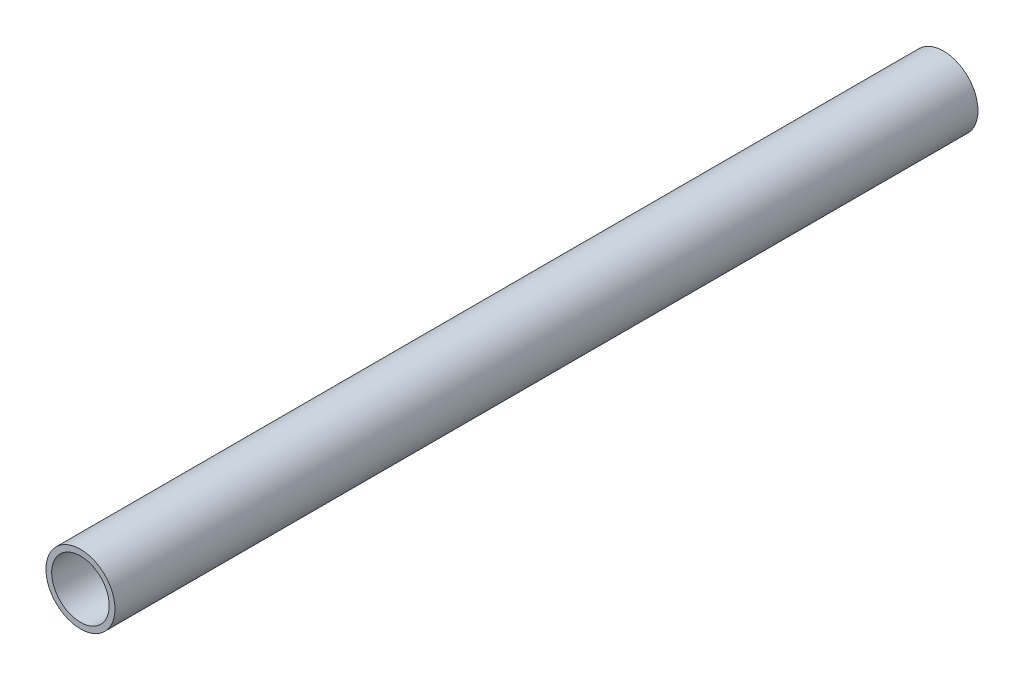
ISO-10303-21;
HEADER;
FILE_DESCRIPTION(('STEP AP214'),'2;1');
FILE_NAME('part.step','',(''),(''),'','','');
FILE_SCHEMA(('AUTOMOTIVE_DESIGN { 1 0 10303 214 1 1 1 1 }'));
ENDSEC;
DATA;
#1=APPLICATION_CONTEXT('core data for automotive mechanical design processes');
#2=APPLICATION_PROTOCOL_DEFINITION('international standard','automotive_design',2000,#1);
#3=PRODUCT_CONTEXT('',#1,'mechanical');
#4=PRODUCT('Part','Part','',(#3));
#5=PRODUCT_RELATED_PRODUCT_CATEGORY('part','',(#4));
#6=PRODUCT_DEFINITION_FORMATION('','',#4);
#7=PRODUCT_DEFINITION_CONTEXT('part definition',#1,'design');
#8=PRODUCT_DEFINITION('design','',#6,#7);
#9=PRODUCT_DEFINITION_SHAPE('','',#8);
#10=(LENGTH_UNIT() NAMED_UNIT(*) SI_UNIT(.MILLI.,.METRE.));
#11=(NAMED_UNIT(*) PLANE_ANGLE_UNIT() SI_UNIT($,.RADIAN.));
#12=(NAMED_UNIT(*) SI_UNIT($,.STERADIAN.) SOLID_ANGLE_UNIT());
#13=UNCERTAINTY_MEASURE_WITH_UNIT(LENGTH_MEASURE(1.E-05),#10,'distance_accuracy_value','');
#14=(GEOMETRIC_REPRESENTATION_CONTEXT(3) GLOBAL_UNCERTAINTY_ASSIGNED_CONTEXT((#13)) GLOBAL_UNIT_ASSIGNED_CONTEXT((#10,
#11,#12)) REPRESENTATION_CONTEXT('',''));
#15=CARTESIAN_POINT('',(0.,0.,0.));
#16=DIRECTION('',(0.,0.,1.));
#17=DIRECTION('',(1.,0.,0.));
#18=AXIS2_PLACEMENT_3D('',#15,#16,#17);
#19=CARTESIAN_POINT('',(0.,0.,150.));
#20=DIRECTION('',(0.,0.,1.));
#21=DIRECTION('',(1.,0.,0.));
#22=AXIS2_PLACEMENT_3D('',#19,#20,#21);
#23=PLANE('',#22);
#24=CARTESIAN_POINT('',(0.,0.,150.));
#25=DIRECTION('',(0.,0.,1.));
#26=DIRECTION('',(1.,0.,0.));
#27=AXIS2_PLACEMENT_3D('',#24,#25,#26);
#28=CIRCLE('',#27,6.);
#29=CARTESIAN_POINT('',(6.,0.,150.));
#30=VERTEX_POINT('',#29);
#31=EDGE_CURVE('E10',#30,#30,#28,.T.);
#32=ORIENTED_EDGE('',*,*,#31,.T.);
#33=EDGE_LOOP('',(#32));
#34=FACE_BOUND('',#33,.T.);
#35=CARTESIAN_POINT('',(0.,0.,150.));
#36=DIRECTION('',(0.,0.,1.));
#37=DIRECTION('',(1.,0.,0.));
#38=AXIS2_PLACEMENT_3D('',#35,#36,#37);
#39=CIRCLE('',#38,5.);
#40=CARTESIAN_POINT('',(5.,0.,150.));
#41=VERTEX_POINT('',#40);
#42=EDGE_CURVE('E41',#41,#41,#39,.T.);
#43=ORIENTED_EDGE('',*,*,#42,.F.);
#44=EDGE_LOOP('',(#43));
#45=FACE_BOUND('',#44,.T.);
#46=ADVANCED_FACE('F30',(#34,#45),#23,.T.);
#47=CARTESIAN_POINT('',(0.,0.,0.));
#48=DIRECTION('',(0.,0.,1.));
#49=DIRECTION('',(1.,0.,0.));
#50=AXIS2_PLACEMENT_3D('',#47,#48,#49);
#51=PLANE('',#50);
#52=CARTESIAN_POINT('',(0.,0.,0.));
#53=DIRECTION('',(0.,0.,1.));
#54=DIRECTION('',(1.,0.,0.));
#55=AXIS2_PLACEMENT_3D('',#52,#53,#54);
#56=CIRCLE('',#55,6.);
#57=CARTESIAN_POINT('',(6.,0.,0.));
#58=VERTEX_POINT('',#57);
#59=EDGE_CURVE('E34',#58,#58,#56,.T.);
#60=ORIENTED_EDGE('',*,*,#59,.F.);
#61=EDGE_LOOP('',(#60));
#62=FACE_BOUND('',#61,.T.);
#63=CARTESIAN_POINT('',(0.,0.,0.));
#64=DIRECTION('',(0.,0.,1.));
#65=DIRECTION('',(1.,0.,0.));
#66=AXIS2_PLACEMENT_3D('',#63,#64,#65);
#67=CIRCLE('',#66,5.);
#68=CARTESIAN_POINT('',(5.,0.,0.));
#69=VERTEX_POINT('',#68);
#70=EDGE_CURVE('E43',#69,#69,#67,.T.);
#71=ORIENTED_EDGE('',*,*,#70,.T.);
#72=EDGE_LOOP('',(#71));
#73=FACE_BOUND('',#72,.T.);
#74=ADVANCED_FACE('F53',(#62,#73),#51,.F.);
#75=CARTESIAN_POINT('',(0.,0.,150.));
#76=DIRECTION('',(0.,0.,-1.));
#77=DIRECTION('',(-1.,0.,0.));
#78=AXIS2_PLACEMENT_3D('',#75,#76,#77);
#79=CYLINDRICAL_SURFACE('',#78,6.);
#80=ORIENTED_EDGE('',*,*,#31,.F.);
#81=EDGE_LOOP('',(#80));
#82=FACE_BOUND('',#81,.T.);
#83=ORIENTED_EDGE('',*,*,#59,.T.);
#84=EDGE_LOOP('',(#83));
#85=FACE_BOUND('',#84,.T.);
#86=ADVANCED_FACE('F32',(#82,#85),#79,.T.);
#87=CARTESIAN_POINT('',(0.,0.,150.));
#88=DIRECTION('',(0.,0.,-1.));
#89=DIRECTION('',(-1.,0.,0.));
#90=AXIS2_PLACEMENT_3D('',#87,#88,#89);
#91=CYLINDRICAL_SURFACE('',#90,5.);
#92=ORIENTED_EDGE('',*,*,#42,.T.);
#93=EDGE_LOOP('',(#92));
#94=FACE_BOUND('',#93,.T.);
#95=ORIENTED_EDGE('',*,*,#70,.F.);
#96=EDGE_LOOP('',(#95));
#97=FACE_BOUND('',#96,.T.);
#98=ADVANCED_FACE('F49',(#94,#97),#91,.F.);
#99=CLOSED_SHELL('',(#46,#74,#86,#98));
#100=MANIFOLD_SOLID_BREP('B2',#99);
#101=ADVANCED_BREP_SHAPE_REPRESENTATION('',(#18,#100),#14);
#102=SHAPE_DEFINITION_REPRESENTATION(#9,#101);
ENDSEC;
END-ISO-10303-21;
